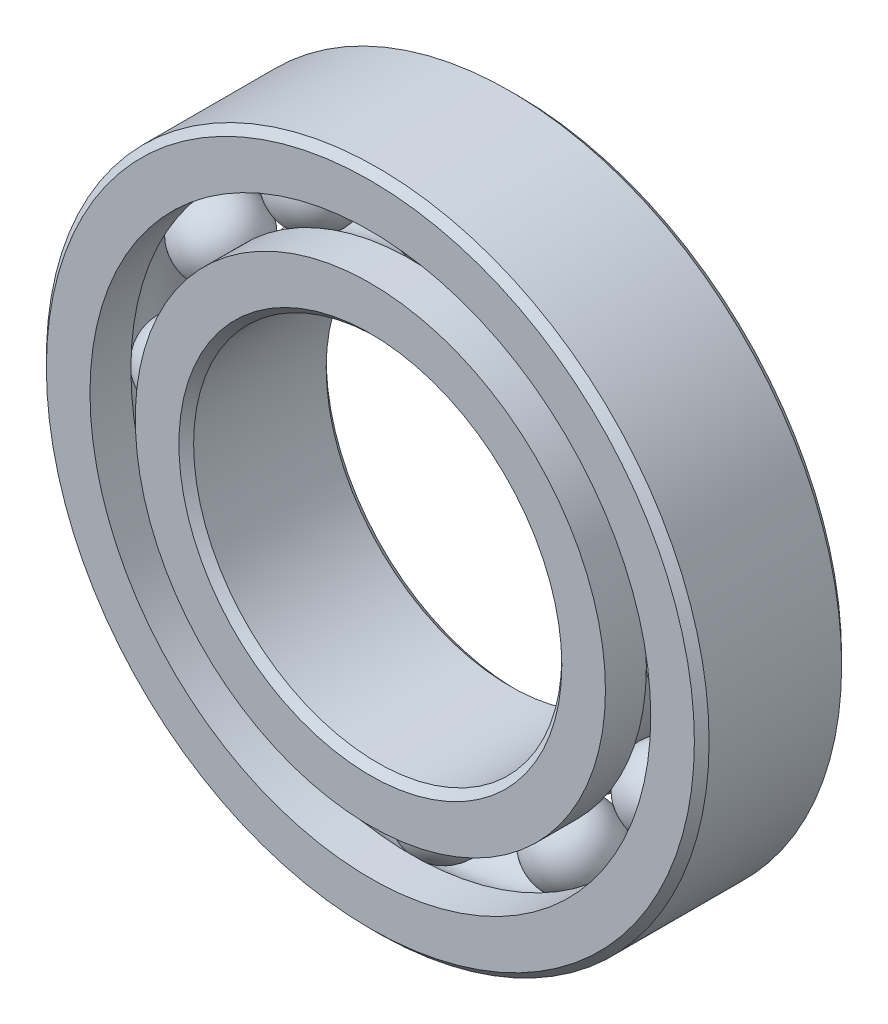
ISO-10303-21;
HEADER;
FILE_DESCRIPTION(('STEP AP214'),'2;1');
FILE_NAME('part.step','',(''),(''),'','','');
FILE_SCHEMA(('AUTOMOTIVE_DESIGN { 1 0 10303 214 1 1 1 1 }'));
ENDSEC;
DATA;
#1=APPLICATION_CONTEXT('core data for automotive mechanical design processes');
#2=APPLICATION_PROTOCOL_DEFINITION('international standard','automotive_design',2000,#1);
#3=PRODUCT_CONTEXT('',#1,'mechanical');
#4=PRODUCT('Part','Part','',(#3));
#5=PRODUCT_RELATED_PRODUCT_CATEGORY('part','',(#4));
#6=PRODUCT_DEFINITION_FORMATION('','',#4);
#7=PRODUCT_DEFINITION_CONTEXT('part definition',#1,'design');
#8=PRODUCT_DEFINITION('design','',#6,#7);
#9=PRODUCT_DEFINITION_SHAPE('','',#8);
#10=(LENGTH_UNIT() NAMED_UNIT(*) SI_UNIT(.MILLI.,.METRE.));
#11=(NAMED_UNIT(*) PLANE_ANGLE_UNIT() SI_UNIT($,.RADIAN.));
#12=(NAMED_UNIT(*) SI_UNIT($,.STERADIAN.) SOLID_ANGLE_UNIT());
#13=UNCERTAINTY_MEASURE_WITH_UNIT(LENGTH_MEASURE(1.E-05),#10,'distance_accuracy_value','');
#14=(GEOMETRIC_REPRESENTATION_CONTEXT(3) GLOBAL_UNCERTAINTY_ASSIGNED_CONTEXT((#13)) GLOBAL_UNIT_ASSIGNED_CONTEXT((#10,
#11,#12)) REPRESENTATION_CONTEXT('',''));
#15=CARTESIAN_POINT('',(0.,0.,0.));
#16=DIRECTION('',(0.,0.,1.));
#17=DIRECTION('',(1.,0.,0.));
#18=AXIS2_PLACEMENT_3D('',#15,#16,#17);
#19=CARTESIAN_POINT('',(-17.4999999999996,30.3108891324556,0.));
#20=DIRECTION('',(0.,0.,1.));
#21=DIRECTION('',(-0.499999999999989,0.866025403784445,0.));
#22=AXIS2_PLACEMENT_3D('',#19,#20,#21);
#23=SPHERICAL_SURFACE('',#22,5.40560283789466);
#24=CARTESIAN_POINT('',(-17.4999999999996,30.3108891324556,5.40560283789466));
#25=VERTEX_POINT('',#24);
#26=VERTEX_LOOP('',#25);
#27=FACE_BOUND('',#26,.T.);
#28=ADVANCED_FACE('F39',(#27),#23,.T.);
#29=CLOSED_SHELL('',(#28));
#30=MANIFOLD_SOLID_BREP('B2',#29);
#31=CARTESIAN_POINT('',(-30.3108891324552,17.5000000000004,0.));
#32=DIRECTION('',(0.,0.,1.));
#33=DIRECTION('',(-0.866025403784433,0.50000000000001,0.));
#34=AXIS2_PLACEMENT_3D('',#31,#32,#33);
#35=SPHERICAL_SURFACE('',#34,5.40560283789466);
#36=CARTESIAN_POINT('',(-30.3108891324552,17.5000000000004,5.40560283789466));
#37=VERTEX_POINT('',#36);
#38=VERTEX_LOOP('',#37);
#39=FACE_BOUND('',#38,.T.);
#40=ADVANCED_FACE('F59',(#39),#35,.T.);
#41=CLOSED_SHELL('',(#40));
#42=MANIFOLD_SOLID_BREP('B6',#41);
#43=CARTESIAN_POINT('',(-35.,3.66605540578529E-13,0.));
#44=DIRECTION('',(0.,0.,1.));
#45=DIRECTION('',(-1.,0.,0.));
#46=AXIS2_PLACEMENT_3D('',#43,#44,#45);
#47=SPHERICAL_SURFACE('',#46,5.40560283789466);
#48=CARTESIAN_POINT('',(-35.,3.66605540578529E-13,5.40560283789466));
#49=VERTEX_POINT('',#48);
#50=VERTEX_LOOP('',#49);
#51=FACE_BOUND('',#50,.T.);
#52=ADVANCED_FACE('F79',(#51),#47,.T.);
#53=CLOSED_SHELL('',(#52));
#54=MANIFOLD_SOLID_BREP('B35',#53);
#55=CARTESIAN_POINT('',(-30.3108891324555,-17.4999999999997,0.));
#56=DIRECTION('',(0.,0.,1.));
#57=DIRECTION('',(-0.866025403784443,-0.499999999999992,0.));
#58=AXIS2_PLACEMENT_3D('',#55,#56,#57);
#59=SPHERICAL_SURFACE('',#58,5.40560283789466);
#60=CARTESIAN_POINT('',(-30.3108891324555,-17.4999999999997,5.40560283789466));
#61=VERTEX_POINT('',#60);
#62=VERTEX_LOOP('',#61);
#63=FACE_BOUND('',#62,.T.);
#64=ADVANCED_FACE('F99',(#63),#59,.T.);
#65=CLOSED_SHELL('',(#64));
#66=MANIFOLD_SOLID_BREP('B55',#65);
#67=CARTESIAN_POINT('',(-17.5000000000003,-30.3108891324552,0.));
#68=DIRECTION('',(0.,0.,1.));
#69=DIRECTION('',(-0.500000000000007,-0.866025403784435,0.));
#70=AXIS2_PLACEMENT_3D('',#67,#68,#69);
#71=SPHERICAL_SURFACE('',#70,5.40560283789466);
#72=CARTESIAN_POINT('',(-17.5000000000003,-30.3108891324552,5.40560283789466));
#73=VERTEX_POINT('',#72);
#74=VERTEX_LOOP('',#73);
#75=FACE_BOUND('',#74,.T.);
#76=ADVANCED_FACE('F119',(#75),#71,.T.);
#77=CLOSED_SHELL('',(#76));
#78=MANIFOLD_SOLID_BREP('B75',#77);
#79=CARTESIAN_POINT('',(-2.44403693719019E-13,-35.,0.));
#80=DIRECTION('',(0.,0.,1.));
#81=DIRECTION('',(0.,-1.,0.));
#82=AXIS2_PLACEMENT_3D('',#79,#80,#81);
#83=SPHERICAL_SURFACE('',#82,5.40560283789466);
#84=CARTESIAN_POINT('',(-2.44403693719019E-13,-35.,5.40560283789466));
#85=VERTEX_POINT('',#84);
#86=VERTEX_LOOP('',#85);
#87=FACE_BOUND('',#86,.T.);
#88=ADVANCED_FACE('F139',(#87),#83,.T.);
#89=CLOSED_SHELL('',(#88));
#90=MANIFOLD_SOLID_BREP('B95',#89);
#91=CARTESIAN_POINT('',(17.4999999999998,-30.3108891324555,0.));
#92=DIRECTION('',(0.,0.,1.));
#93=DIRECTION('',(0.499999999999995,-0.866025403784442,0.));
#94=AXIS2_PLACEMENT_3D('',#91,#92,#93);
#95=SPHERICAL_SURFACE('',#94,5.40560283789466);
#96=CARTESIAN_POINT('',(17.4999999999998,-30.3108891324555,5.40560283789466));
#97=VERTEX_POINT('',#96);
#98=VERTEX_LOOP('',#97);
#99=FACE_BOUND('',#98,.T.);
#100=ADVANCED_FACE('F159',(#99),#95,.T.);
#101=CLOSED_SHELL('',(#100));
#102=MANIFOLD_SOLID_BREP('B115',#101);
#103=CARTESIAN_POINT('',(30.3108891324553,-17.5000000000001,0.));
#104=DIRECTION('',(0.,0.,1.));
#105=DIRECTION('',(0.866025403784436,-0.500000000000004,0.));
#106=AXIS2_PLACEMENT_3D('',#103,#104,#105);
#107=SPHERICAL_SURFACE('',#106,5.40560283789466);
#108=CARTESIAN_POINT('',(30.3108891324553,-17.5000000000001,5.40560283789466));
#109=VERTEX_POINT('',#108);
#110=VERTEX_LOOP('',#109);
#111=FACE_BOUND('',#110,.T.);
#112=ADVANCED_FACE('F179',(#111),#107,.T.);
#113=CLOSED_SHELL('',(#112));
#114=MANIFOLD_SOLID_BREP('B135',#113);
#115=CARTESIAN_POINT('',(35.,-1.2220184685951E-13,0.));
#116=DIRECTION('',(0.,0.,1.));
#117=DIRECTION('',(1.,0.,0.));
#118=AXIS2_PLACEMENT_3D('',#115,#116,#117);
#119=SPHERICAL_SURFACE('',#118,5.40560283789466);
#120=CARTESIAN_POINT('',(35.,-1.2220184685951E-13,5.40560283789466));
#121=VERTEX_POINT('',#120);
#122=VERTEX_LOOP('',#121);
#123=FACE_BOUND('',#122,.T.);
#124=ADVANCED_FACE('F199',(#123),#119,.T.);
#125=CLOSED_SHELL('',(#124));
#126=MANIFOLD_SOLID_BREP('B155',#125);
#127=CARTESIAN_POINT('',(30.3108891324554,17.4999999999999,0.));
#128=DIRECTION('',(0.,0.,1.));
#129=DIRECTION('',(0.86602540378444,0.499999999999998,0.));
#130=AXIS2_PLACEMENT_3D('',#127,#128,#129);
#131=SPHERICAL_SURFACE('',#130,5.40560283789466);
#132=CARTESIAN_POINT('',(30.3108891324554,17.4999999999999,5.40560283789466));
#133=VERTEX_POINT('',#132);
#134=VERTEX_LOOP('',#133);
#135=FACE_BOUND('',#134,.T.);
#136=ADVANCED_FACE('F219',(#135),#131,.T.);
#137=CLOSED_SHELL('',(#136));
#138=MANIFOLD_SOLID_BREP('B175',#137);
#139=CARTESIAN_POINT('',(17.5,30.3108891324553,0.));
#140=DIRECTION('',(0.,0.,1.));
#141=DIRECTION('',(0.500000000000001,0.866025403784438,0.));
#142=AXIS2_PLACEMENT_3D('',#139,#140,#141);
#143=SPHERICAL_SURFACE('',#142,5.40560283789466);
#144=CARTESIAN_POINT('',(17.5,30.3108891324553,5.40560283789466));
#145=VERTEX_POINT('',#144);
#146=VERTEX_LOOP('',#145);
#147=FACE_BOUND('',#146,.T.);
#148=ADVANCED_FACE('F239',(#147),#143,.T.);
#149=CLOSED_SHELL('',(#148));
#150=MANIFOLD_SOLID_BREP('B195',#149);
#151=CARTESIAN_POINT('',(0.,35.,0.));
#152=DIRECTION('',(0.,0.,1.));
#153=DIRECTION('',(0.,1.,0.));
#154=AXIS2_PLACEMENT_3D('',#151,#152,#153);
#155=SPHERICAL_SURFACE('',#154,5.40560283789466);
#156=CARTESIAN_POINT('',(0.,35.,5.40560283789466));
#157=VERTEX_POINT('',#156);
#158=VERTEX_LOOP('',#157);
#159=FACE_BOUND('',#158,.T.);
#160=ADVANCED_FACE('F261',(#159),#155,.T.);
#161=CLOSED_SHELL('',(#160));
#162=MANIFOLD_SOLID_BREP('B215',#161);
#163=CARTESIAN_POINT('',(0.,31.9230769230769,10.));
#164=DIRECTION('',(0.,0.,-1.));
#165=DIRECTION('',(-1.,0.,0.));
#166=AXIS2_PLACEMENT_3D('',#163,#164,#165);
#167=PLANE('',#166);
#168=CARTESIAN_POINT('',(0.,0.,10.));
#169=DIRECTION('',(0.,0.,1.));
#170=DIRECTION('',(1.,0.,0.));
#171=AXIS2_PLACEMENT_3D('',#168,#169,#170);
#172=CIRCLE('',#171,26.);
#173=CARTESIAN_POINT('',(26.,0.,10.));
#174=VERTEX_POINT('',#173);
#175=EDGE_CURVE('E308',#174,#174,#172,.T.);
#176=ORIENTED_EDGE('',*,*,#175,.F.);
#177=EDGE_LOOP('',(#176));
#178=FACE_BOUND('',#177,.T.);
#179=CARTESIAN_POINT('',(0.,0.,10.));
#180=DIRECTION('',(0.,0.,1.));
#181=DIRECTION('',(1.,0.,0.));
#182=AXIS2_PLACEMENT_3D('',#179,#180,#181);
#183=CIRCLE('',#182,31.9230769230769);
#184=CARTESIAN_POINT('',(31.9230769230769,0.,10.));
#185=VERTEX_POINT('',#184);
#186=EDGE_CURVE('E260',#185,#185,#183,.T.);
#187=ORIENTED_EDGE('',*,*,#186,.T.);
#188=EDGE_LOOP('',(#187));
#189=FACE_BOUND('',#188,.T.);
#190=ADVANCED_FACE('F280',(#178,#189),#167,.F.);
#191=CARTESIAN_POINT('',(0.,0.,10.));
#192=DIRECTION('',(0.,0.,1.));
#193=DIRECTION('',(1.,0.,0.));
#194=AXIS2_PLACEMENT_3D('',#191,#192,#193);
#195=CYLINDRICAL_SURFACE('',#194,31.9230769230769);
#196=ORIENTED_EDGE('',*,*,#186,.F.);
#197=EDGE_LOOP('',(#196));
#198=FACE_BOUND('',#197,.T.);
#199=CARTESIAN_POINT('',(0.,0.,4.44444444444444));
#200=DIRECTION('',(0.,0.,1.));
#201=DIRECTION('',(1.,0.,0.));
#202=AXIS2_PLACEMENT_3D('',#199,#200,#201);
#203=CIRCLE('',#202,31.9230769230769);
#204=CARTESIAN_POINT('',(31.9230769230769,0.,4.44444444444444));
#205=VERTEX_POINT('',#204);
#206=EDGE_CURVE('E286',#205,#205,#203,.T.);
#207=ORIENTED_EDGE('',*,*,#206,.T.);
#208=EDGE_LOOP('',(#207));
#209=FACE_BOUND('',#208,.T.);
#210=ADVANCED_FACE('F315',(#198,#209),#195,.T.);
#211=CARTESIAN_POINT('',(0.,0.,0.));
#212=DIRECTION('',(0.,0.,1.));
#213=DIRECTION('',(1.,0.,0.));
#214=AXIS2_PLACEMENT_3D('',#211,#212,#213);
#215=TOROIDAL_SURFACE('',#214,35.,5.40560283789466);
#216=ORIENTED_EDGE('',*,*,#206,.F.);
#217=EDGE_LOOP('',(#216));
#218=FACE_BOUND('',#217,.T.);
#219=CARTESIAN_POINT('',(0.,0.,-4.44444444444445));
#220=DIRECTION('',(0.,0.,1.));
#221=DIRECTION('',(1.,0.,0.));
#222=AXIS2_PLACEMENT_3D('',#219,#220,#221);
#223=CIRCLE('',#222,31.9230769230769);
#224=CARTESIAN_POINT('',(31.9230769230769,0.,-4.44444444444445));
#225=VERTEX_POINT('',#224);
#226=EDGE_CURVE('E290',#225,#225,#223,.T.);
#227=ORIENTED_EDGE('',*,*,#226,.T.);
#228=EDGE_LOOP('',(#227));
#229=FACE_BOUND('',#228,.T.);
#230=ADVANCED_FACE('F319',(#218,#229),#215,.F.);
#231=CARTESIAN_POINT('',(0.,0.,10.));
#232=DIRECTION('',(0.,0.,1.));
#233=DIRECTION('',(1.,0.,0.));
#234=AXIS2_PLACEMENT_3D('',#231,#232,#233);
#235=CYLINDRICAL_SURFACE('',#234,31.9230769230769);
#236=ORIENTED_EDGE('',*,*,#226,.F.);
#237=EDGE_LOOP('',(#236));
#238=FACE_BOUND('',#237,.T.);
#239=CARTESIAN_POINT('',(0.,0.,-10.));
#240=DIRECTION('',(0.,0.,1.));
#241=DIRECTION('',(1.,0.,0.));
#242=AXIS2_PLACEMENT_3D('',#239,#240,#241);
#243=CIRCLE('',#242,31.9230769230769);
#244=CARTESIAN_POINT('',(31.9230769230769,0.,-10.));
#245=VERTEX_POINT('',#244);
#246=EDGE_CURVE('E294',#245,#245,#243,.T.);
#247=ORIENTED_EDGE('',*,*,#246,.T.);
#248=EDGE_LOOP('',(#247));
#249=FACE_BOUND('',#248,.T.);
#250=ADVANCED_FACE('F324',(#238,#249),#235,.T.);
#251=CARTESIAN_POINT('',(0.,26.,-10.));
#252=DIRECTION('',(0.,0.,1.));
#253=DIRECTION('',(1.,0.,0.));
#254=AXIS2_PLACEMENT_3D('',#251,#252,#253);
#255=PLANE('',#254);
#256=ORIENTED_EDGE('',*,*,#246,.F.);
#257=EDGE_LOOP('',(#256));
#258=FACE_BOUND('',#257,.T.);
#259=CARTESIAN_POINT('',(0.,0.,-10.));
#260=DIRECTION('',(0.,0.,1.));
#261=DIRECTION('',(1.,0.,0.));
#262=AXIS2_PLACEMENT_3D('',#259,#260,#261);
#263=CIRCLE('',#262,26.);
#264=CARTESIAN_POINT('',(26.,0.,-10.));
#265=VERTEX_POINT('',#264);
#266=EDGE_CURVE('E299',#265,#265,#263,.T.);
#267=ORIENTED_EDGE('',*,*,#266,.T.);
#268=EDGE_LOOP('',(#267));
#269=FACE_BOUND('',#268,.T.);
#270=ADVANCED_FACE('F330',(#258,#269),#255,.F.);
#271=CARTESIAN_POINT('',(0.,0.,-9.));
#272=DIRECTION('',(0.,0.,-1.));
#273=DIRECTION('',(-1.,0.,0.));
#274=AXIS2_PLACEMENT_3D('',#271,#272,#273);
#275=CONICAL_SURFACE('',#274,25.,0.785398163397448);
#276=ORIENTED_EDGE('',*,*,#266,.F.);
#277=EDGE_LOOP('',(#276));
#278=FACE_BOUND('',#277,.T.);
#279=CARTESIAN_POINT('',(0.,0.,-9.));
#280=DIRECTION('',(0.,0.,1.));
#281=DIRECTION('',(1.,0.,0.));
#282=AXIS2_PLACEMENT_3D('',#279,#280,#281);
#283=CIRCLE('',#282,25.);
#284=CARTESIAN_POINT('',(25.,0.,-9.));
#285=VERTEX_POINT('',#284);
#286=EDGE_CURVE('E302',#285,#285,#283,.T.);
#287=ORIENTED_EDGE('',*,*,#286,.T.);
#288=EDGE_LOOP('',(#287));
#289=FACE_BOUND('',#288,.T.);
#290=ADVANCED_FACE('F334',(#278,#289),#275,.F.);
#291=CARTESIAN_POINT('',(0.,0.,10.));
#292=DIRECTION('',(0.,0.,1.));
#293=DIRECTION('',(1.,0.,0.));
#294=AXIS2_PLACEMENT_3D('',#291,#292,#293);
#295=CYLINDRICAL_SURFACE('',#294,25.);
#296=ORIENTED_EDGE('',*,*,#286,.F.);
#297=EDGE_LOOP('',(#296));
#298=FACE_BOUND('',#297,.T.);
#299=CARTESIAN_POINT('',(0.,0.,9.));
#300=DIRECTION('',(0.,0.,1.));
#301=DIRECTION('',(1.,0.,0.));
#302=AXIS2_PLACEMENT_3D('',#299,#300,#301);
#303=CIRCLE('',#302,25.);
#304=CARTESIAN_POINT('',(25.,0.,9.));
#305=VERTEX_POINT('',#304);
#306=EDGE_CURVE('E305',#305,#305,#303,.T.);
#307=ORIENTED_EDGE('',*,*,#306,.T.);
#308=EDGE_LOOP('',(#307));
#309=FACE_BOUND('',#308,.T.);
#310=ADVANCED_FACE('F338',(#298,#309),#295,.F.);
#311=CARTESIAN_POINT('',(0.,0.,10.));
#312=DIRECTION('',(0.,0.,1.));
#313=DIRECTION('',(1.,0.,0.));
#314=AXIS2_PLACEMENT_3D('',#311,#312,#313);
#315=CONICAL_SURFACE('',#314,26.,0.785398163397446);
#316=ORIENTED_EDGE('',*,*,#306,.F.);
#317=EDGE_LOOP('',(#316));
#318=FACE_BOUND('',#317,.T.);
#319=ORIENTED_EDGE('',*,*,#175,.T.);
#320=EDGE_LOOP('',(#319));
#321=FACE_BOUND('',#320,.T.);
#322=ADVANCED_FACE('F312',(#318,#321),#315,.F.);
#323=CLOSED_SHELL('',(#190,#210,#230,#250,#270,#290,#310,#322));
#324=MANIFOLD_SOLID_BREP('B235',#323);
#325=CARTESIAN_POINT('',(0.,0.,9.00000000000001));
#326=DIRECTION('',(0.,0.,-1.));
#327=DIRECTION('',(-1.,0.,0.));
#328=AXIS2_PLACEMENT_3D('',#325,#326,#327);
#329=CONICAL_SURFACE('',#328,45.,0.785398163397448);
#330=CARTESIAN_POINT('',(0.,0.,10.));
#331=DIRECTION('',(0.,0.,1.));
#332=DIRECTION('',(1.,0.,0.));
#333=AXIS2_PLACEMENT_3D('',#330,#331,#332);
#334=CIRCLE('',#333,44.);
#335=CARTESIAN_POINT('',(44.,0.,10.));
#336=VERTEX_POINT('',#335);
#337=EDGE_CURVE('E429',#336,#336,#334,.T.);
#338=ORIENTED_EDGE('',*,*,#337,.F.);
#339=EDGE_LOOP('',(#338));
#340=FACE_BOUND('',#339,.T.);
#341=CARTESIAN_POINT('',(0.,0.,9.00000000000001));
#342=DIRECTION('',(0.,0.,1.));
#343=DIRECTION('',(1.,0.,0.));
#344=AXIS2_PLACEMENT_3D('',#341,#342,#343);
#345=CIRCLE('',#344,45.);
#346=CARTESIAN_POINT('',(45.,0.,9.00000000000001));
#347=VERTEX_POINT('',#346);
#348=EDGE_CURVE('E279',#347,#347,#345,.T.);
#349=ORIENTED_EDGE('',*,*,#348,.T.);
#350=EDGE_LOOP('',(#349));
#351=FACE_BOUND('',#350,.T.);
#352=ADVANCED_FACE('F401',(#340,#351),#329,.T.);
#353=CARTESIAN_POINT('',(0.,0.,10.));
#354=DIRECTION('',(0.,0.,1.));
#355=DIRECTION('',(1.,0.,0.));
#356=AXIS2_PLACEMENT_3D('',#353,#354,#355);
#357=CYLINDRICAL_SURFACE('',#356,45.);
#358=ORIENTED_EDGE('',*,*,#348,.F.);
#359=EDGE_LOOP('',(#358));
#360=FACE_BOUND('',#359,.T.);
#361=CARTESIAN_POINT('',(0.,0.,-9.));
#362=DIRECTION('',(0.,0.,1.));
#363=DIRECTION('',(1.,0.,0.));
#364=AXIS2_PLACEMENT_3D('',#361,#362,#363);
#365=CIRCLE('',#364,45.);
#366=CARTESIAN_POINT('',(45.,0.,-9.));
#367=VERTEX_POINT('',#366);
#368=EDGE_CURVE('E407',#367,#367,#365,.T.);
#369=ORIENTED_EDGE('',*,*,#368,.T.);
#370=EDGE_LOOP('',(#369));
#371=FACE_BOUND('',#370,.T.);
#372=ADVANCED_FACE('F436',(#360,#371),#357,.T.);
#373=CARTESIAN_POINT('',(0.,0.,-10.));
#374=DIRECTION('',(0.,0.,1.));
#375=DIRECTION('',(1.,0.,0.));
#376=AXIS2_PLACEMENT_3D('',#373,#374,#375);
#377=CONICAL_SURFACE('',#376,44.,0.785398163397448);
#378=ORIENTED_EDGE('',*,*,#368,.F.);
#379=EDGE_LOOP('',(#378));
#380=FACE_BOUND('',#379,.T.);
#381=CARTESIAN_POINT('',(0.,0.,-10.));
#382=DIRECTION('',(0.,0.,1.));
#383=DIRECTION('',(1.,0.,0.));
#384=AXIS2_PLACEMENT_3D('',#381,#382,#383);
#385=CIRCLE('',#384,44.);
#386=CARTESIAN_POINT('',(44.,0.,-10.));
#387=VERTEX_POINT('',#386);
#388=EDGE_CURVE('E411',#387,#387,#385,.T.);
#389=ORIENTED_EDGE('',*,*,#388,.T.);
#390=EDGE_LOOP('',(#389));
#391=FACE_BOUND('',#390,.T.);
#392=ADVANCED_FACE('F440',(#380,#391),#377,.T.);
#393=CARTESIAN_POINT('',(0.,44.,-10.));
#394=DIRECTION('',(0.,0.,1.));
#395=DIRECTION('',(1.,0.,0.));
#396=AXIS2_PLACEMENT_3D('',#393,#394,#395);
#397=PLANE('',#396);
#398=ORIENTED_EDGE('',*,*,#388,.F.);
#399=EDGE_LOOP('',(#398));
#400=FACE_BOUND('',#399,.T.);
#401=CARTESIAN_POINT('',(0.,0.,-10.));
#402=DIRECTION('',(0.,0.,1.));
#403=DIRECTION('',(1.,0.,0.));
#404=AXIS2_PLACEMENT_3D('',#401,#402,#403);
#405=CIRCLE('',#404,38.0769230769231);
#406=CARTESIAN_POINT('',(38.0769230769231,0.,-10.));
#407=VERTEX_POINT('',#406);
#408=EDGE_CURVE('E415',#407,#407,#405,.T.);
#409=ORIENTED_EDGE('',*,*,#408,.T.);
#410=EDGE_LOOP('',(#409));
#411=FACE_BOUND('',#410,.T.);
#412=ADVANCED_FACE('F445',(#400,#411),#397,.F.);
#413=CARTESIAN_POINT('',(0.,0.,10.));
#414=DIRECTION('',(0.,0.,1.));
#415=DIRECTION('',(1.,0.,0.));
#416=AXIS2_PLACEMENT_3D('',#413,#414,#415);
#417=CYLINDRICAL_SURFACE('',#416,38.0769230769231);
#418=ORIENTED_EDGE('',*,*,#408,.F.);
#419=EDGE_LOOP('',(#418));
#420=FACE_BOUND('',#419,.T.);
#421=CARTESIAN_POINT('',(0.,0.,-4.44444444444444));
#422=DIRECTION('',(0.,0.,1.));
#423=DIRECTION('',(1.,0.,0.));
#424=AXIS2_PLACEMENT_3D('',#421,#422,#423);
#425=CIRCLE('',#424,38.0769230769231);
#426=CARTESIAN_POINT('',(38.0769230769231,0.,-4.44444444444444));
#427=VERTEX_POINT('',#426);
#428=EDGE_CURVE('E420',#427,#427,#425,.T.);
#429=ORIENTED_EDGE('',*,*,#428,.T.);
#430=EDGE_LOOP('',(#429));
#431=FACE_BOUND('',#430,.T.);
#432=ADVANCED_FACE('F451',(#420,#431),#417,.F.);
#433=CARTESIAN_POINT('',(0.,0.,0.));
#434=DIRECTION('',(0.,0.,1.));
#435=DIRECTION('',(1.,0.,0.));
#436=AXIS2_PLACEMENT_3D('',#433,#434,#435);
#437=TOROIDAL_SURFACE('',#436,35.,5.40560283789466);
#438=ORIENTED_EDGE('',*,*,#428,.F.);
#439=EDGE_LOOP('',(#438));
#440=FACE_BOUND('',#439,.T.);
#441=CARTESIAN_POINT('',(0.,0.,4.44444444444444));
#442=DIRECTION('',(0.,0.,1.));
#443=DIRECTION('',(1.,0.,0.));
#444=AXIS2_PLACEMENT_3D('',#441,#442,#443);
#445=CIRCLE('',#444,38.0769230769231);
#446=CARTESIAN_POINT('',(38.0769230769231,0.,4.44444444444444));
#447=VERTEX_POINT('',#446);
#448=EDGE_CURVE('E423',#447,#447,#445,.T.);
#449=ORIENTED_EDGE('',*,*,#448,.T.);
#450=EDGE_LOOP('',(#449));
#451=FACE_BOUND('',#450,.T.);
#452=ADVANCED_FACE('F455',(#440,#451),#437,.F.);
#453=CARTESIAN_POINT('',(0.,0.,10.));
#454=DIRECTION('',(0.,0.,1.));
#455=DIRECTION('',(1.,0.,0.));
#456=AXIS2_PLACEMENT_3D('',#453,#454,#455);
#457=CYLINDRICAL_SURFACE('',#456,38.0769230769231);
#458=ORIENTED_EDGE('',*,*,#448,.F.);
#459=EDGE_LOOP('',(#458));
#460=FACE_BOUND('',#459,.T.);
#461=CARTESIAN_POINT('',(0.,0.,10.));
#462=DIRECTION('',(0.,0.,1.));
#463=DIRECTION('',(1.,0.,0.));
#464=AXIS2_PLACEMENT_3D('',#461,#462,#463);
#465=CIRCLE('',#464,38.0769230769231);
#466=CARTESIAN_POINT('',(38.0769230769231,0.,10.));
#467=VERTEX_POINT('',#466);
#468=EDGE_CURVE('E426',#467,#467,#465,.T.);
#469=ORIENTED_EDGE('',*,*,#468,.T.);
#470=EDGE_LOOP('',(#469));
#471=FACE_BOUND('',#470,.T.);
#472=ADVANCED_FACE('F459',(#460,#471),#457,.F.);
#473=CARTESIAN_POINT('',(0.,44.,10.));
#474=DIRECTION('',(0.,0.,-1.));
#475=DIRECTION('',(-1.,0.,0.));
#476=AXIS2_PLACEMENT_3D('',#473,#474,#475);
#477=PLANE('',#476);
#478=ORIENTED_EDGE('',*,*,#468,.F.);
#479=EDGE_LOOP('',(#478));
#480=FACE_BOUND('',#479,.T.);
#481=ORIENTED_EDGE('',*,*,#337,.T.);
#482=EDGE_LOOP('',(#481));
#483=FACE_BOUND('',#482,.T.);
#484=ADVANCED_FACE('F433',(#480,#483),#477,.F.);
#485=CLOSED_SHELL('',(#352,#372,#392,#412,#432,#452,#472,#484));
#486=MANIFOLD_SOLID_BREP('B255',#485);
#487=ADVANCED_BREP_SHAPE_REPRESENTATION('',(#18,#30,#42,#54,#66,#78,#90,#102,#114,#126,#138,
#150,#162,#324,#486),#14);
#488=SHAPE_DEFINITION_REPRESENTATION(#9,#487);
ENDSEC;
END-ISO-10303-21;
